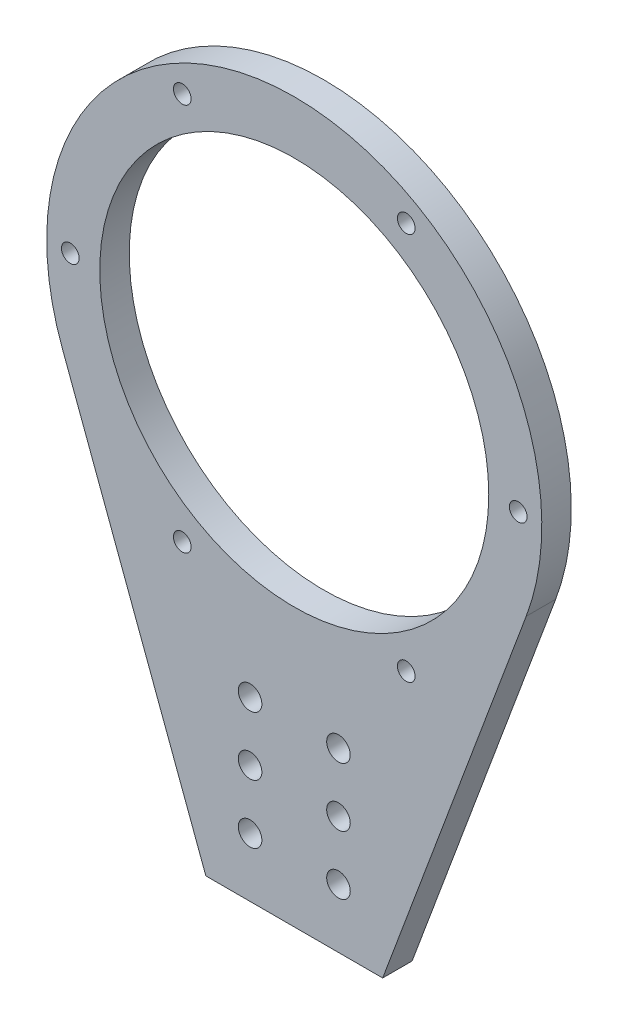
ISO-10303-21;
HEADER;
FILE_DESCRIPTION(('STEP AP214'),'2;1');
FILE_NAME('part.step','',(''),(''),'','','');
FILE_SCHEMA(('AUTOMOTIVE_DESIGN { 1 0 10303 214 1 1 1 1 }'));
ENDSEC;
DATA;
#1=APPLICATION_CONTEXT('core data for automotive mechanical design processes');
#2=APPLICATION_PROTOCOL_DEFINITION('international standard','automotive_design',2000,#1);
#3=PRODUCT_CONTEXT('',#1,'mechanical');
#4=PRODUCT('Part','Part','',(#3));
#5=PRODUCT_RELATED_PRODUCT_CATEGORY('part','',(#4));
#6=PRODUCT_DEFINITION_FORMATION('','',#4);
#7=PRODUCT_DEFINITION_CONTEXT('part definition',#1,'design');
#8=PRODUCT_DEFINITION('design','',#6,#7);
#9=PRODUCT_DEFINITION_SHAPE('','',#8);
#10=(LENGTH_UNIT() NAMED_UNIT(*) SI_UNIT(.MILLI.,.METRE.));
#11=(NAMED_UNIT(*) PLANE_ANGLE_UNIT() SI_UNIT($,.RADIAN.));
#12=(NAMED_UNIT(*) SI_UNIT($,.STERADIAN.) SOLID_ANGLE_UNIT());
#13=UNCERTAINTY_MEASURE_WITH_UNIT(LENGTH_MEASURE(1.E-05),#10,'distance_accuracy_value','');
#14=(GEOMETRIC_REPRESENTATION_CONTEXT(3) GLOBAL_UNCERTAINTY_ASSIGNED_CONTEXT((#13)) GLOBAL_UNIT_ASSIGNED_CONTEXT((#10,
#11,#12)) REPRESENTATION_CONTEXT('',''));
#15=CARTESIAN_POINT('',(0.,0.,0.));
#16=DIRECTION('',(0.,0.,1.));
#17=DIRECTION('',(1.,0.,0.));
#18=AXIS2_PLACEMENT_3D('',#15,#16,#17);
#19=CARTESIAN_POINT('',(0.,0.,5.));
#20=DIRECTION('',(0.,0.,-1.));
#21=DIRECTION('',(-1.,0.,0.));
#22=AXIS2_PLACEMENT_3D('',#19,#20,#21);
#23=CYLINDRICAL_SURFACE('',#22,42.);
#24=CARTESIAN_POINT('',(0.,0.,0.));
#25=DIRECTION('',(0.,0.,1.));
#26=DIRECTION('',(1.,0.,0.));
#27=AXIS2_PLACEMENT_3D('',#24,#25,#26);
#28=CIRCLE('',#27,42.);
#29=CARTESIAN_POINT('',(39.3542837890049,-14.6710717895616,0.));
#30=VERTEX_POINT('',#29);
#31=CARTESIAN_POINT('',(-39.3542837890049,-14.6710717895616,0.));
#32=VERTEX_POINT('',#31);
#33=EDGE_CURVE('E107',#30,#32,#28,.T.);
#34=ORIENTED_EDGE('',*,*,#33,.T.);
#35=DIRECTION('',(0.,0.,-1.));
#36=VECTOR('',#35,1.);
#37=CARTESIAN_POINT('',(-39.3542837890049,-14.6710717895616,5.));
#38=LINE('',#37,#36);
#39=CARTESIAN_POINT('',(-39.3542837890049,-14.6710717895616,5.));
#40=VERTEX_POINT('',#39);
#41=EDGE_CURVE('E11',#40,#32,#38,.T.);
#42=ORIENTED_EDGE('',*,*,#41,.F.);
#43=CARTESIAN_POINT('',(0.,0.,5.));
#44=DIRECTION('',(0.,0.,1.));
#45=DIRECTION('',(1.,0.,0.));
#46=AXIS2_PLACEMENT_3D('',#43,#44,#45);
#47=CIRCLE('',#46,42.);
#48=CARTESIAN_POINT('',(39.3542837890049,-14.6710717895616,5.));
#49=VERTEX_POINT('',#48);
#50=EDGE_CURVE('E80',#49,#40,#47,.T.);
#51=ORIENTED_EDGE('',*,*,#50,.F.);
#52=DIRECTION('',(0.,0.,-1.));
#53=VECTOR('',#52,1.);
#54=CARTESIAN_POINT('',(39.3542837890049,-14.6710717895616,5.));
#55=LINE('',#54,#53);
#56=EDGE_CURVE('E103',#49,#30,#55,.T.);
#57=ORIENTED_EDGE('',*,*,#56,.T.);
#58=EDGE_LOOP('',(#34,#42,#51,#57));
#59=FACE_BOUND('',#58,.T.);
#60=ADVANCED_FACE('F35',(#59),#23,.T.);
#61=CARTESIAN_POINT('',(-39.3542837890049,-14.6710717895616,5.));
#62=DIRECTION('',(-0.937006756881068,-0.3493112330848,0.));
#63=DIRECTION('',(0.3493112330848,-0.937006756881068,0.));
#64=AXIS2_PLACEMENT_3D('',#61,#62,#63);
#65=PLANE('',#64);
#66=DIRECTION('',(-0.3493112330848,0.937006756881068,0.));
#67=VECTOR('',#66,1.);
#68=CARTESIAN_POINT('',(-39.3542837890049,-14.6710717895616,0.));
#69=LINE('',#68,#67);
#70=CARTESIAN_POINT('',(-15.,-80.,0.));
#71=VERTEX_POINT('',#70);
#72=EDGE_CURVE('E90',#71,#32,#69,.T.);
#73=ORIENTED_EDGE('',*,*,#72,.F.);
#74=DIRECTION('',(0.,0.,-1.));
#75=VECTOR('',#74,1.);
#76=CARTESIAN_POINT('',(-15.,-80.,5.));
#77=LINE('',#76,#75);
#78=CARTESIAN_POINT('',(-15.,-80.,5.));
#79=VERTEX_POINT('',#78);
#80=EDGE_CURVE('E45',#79,#71,#77,.T.);
#81=ORIENTED_EDGE('',*,*,#80,.F.);
#82=DIRECTION('',(-0.3493112330848,0.937006756881068,0.));
#83=VECTOR('',#82,1.);
#84=CARTESIAN_POINT('',(-39.3542837890049,-14.6710717895616,5.));
#85=LINE('',#84,#83);
#86=EDGE_CURVE('E88',#79,#40,#85,.T.);
#87=ORIENTED_EDGE('',*,*,#86,.T.);
#88=ORIENTED_EDGE('',*,*,#41,.T.);
#89=EDGE_LOOP('',(#73,#81,#87,#88));
#90=FACE_BOUND('',#89,.T.);
#91=ADVANCED_FACE('F87',(#90),#65,.T.);
#92=CARTESIAN_POINT('',(0.,-80.,5.));
#93=DIRECTION('',(0.,1.,0.));
#94=DIRECTION('',(0.,0.,1.));
#95=AXIS2_PLACEMENT_3D('',#92,#93,#94);
#96=PLANE('',#95);
#97=DIRECTION('',(1.,0.,0.));
#98=VECTOR('',#97,1.);
#99=CARTESIAN_POINT('',(0.,-80.,0.));
#100=LINE('',#99,#98);
#101=CARTESIAN_POINT('',(15.,-80.,0.));
#102=VERTEX_POINT('',#101);
#103=EDGE_CURVE('E69',#71,#102,#100,.T.);
#104=ORIENTED_EDGE('',*,*,#103,.T.);
#105=DIRECTION('',(0.,0.,-1.));
#106=VECTOR('',#105,1.);
#107=CARTESIAN_POINT('',(15.,-80.,5.));
#108=LINE('',#107,#106);
#109=CARTESIAN_POINT('',(15.,-80.,5.));
#110=VERTEX_POINT('',#109);
#111=EDGE_CURVE('E91',#110,#102,#108,.T.);
#112=ORIENTED_EDGE('',*,*,#111,.F.);
#113=DIRECTION('',(1.,0.,0.));
#114=VECTOR('',#113,1.);
#115=CARTESIAN_POINT('',(0.,-80.,5.));
#116=LINE('',#115,#114);
#117=EDGE_CURVE('E93',#79,#110,#116,.T.);
#118=ORIENTED_EDGE('',*,*,#117,.F.);
#119=ORIENTED_EDGE('',*,*,#80,.T.);
#120=EDGE_LOOP('',(#104,#112,#118,#119));
#121=FACE_BOUND('',#120,.T.);
#122=ADVANCED_FACE('F94',(#121),#96,.F.);
#123=CARTESIAN_POINT('',(0.,0.,5.));
#124=DIRECTION('',(0.,0.,-1.));
#125=DIRECTION('',(-1.,0.,0.));
#126=AXIS2_PLACEMENT_3D('',#123,#124,#125);
#127=CYLINDRICAL_SURFACE('',#126,33.);
#128=CARTESIAN_POINT('',(0.,0.,5.));
#129=DIRECTION('',(0.,0.,1.));
#130=DIRECTION('',(1.,0.,0.));
#131=AXIS2_PLACEMENT_3D('',#128,#129,#130);
#132=CIRCLE('',#131,33.);
#133=CARTESIAN_POINT('',(33.,0.,5.));
#134=VERTEX_POINT('',#133);
#135=EDGE_CURVE('E98',#134,#134,#132,.T.);
#136=ORIENTED_EDGE('',*,*,#135,.T.);
#137=EDGE_LOOP('',(#136));
#138=FACE_BOUND('',#137,.T.);
#139=CARTESIAN_POINT('',(0.,0.,0.));
#140=DIRECTION('',(0.,0.,1.));
#141=DIRECTION('',(1.,0.,0.));
#142=AXIS2_PLACEMENT_3D('',#139,#140,#141);
#143=CIRCLE('',#142,33.);
#144=CARTESIAN_POINT('',(33.,0.,0.));
#145=VERTEX_POINT('',#144);
#146=EDGE_CURVE('E104',#145,#145,#143,.T.);
#147=ORIENTED_EDGE('',*,*,#146,.F.);
#148=EDGE_LOOP('',(#147));
#149=FACE_BOUND('',#148,.T.);
#150=ADVANCED_FACE('F37',(#138,#149),#127,.F.);
#151=CARTESIAN_POINT('',(39.3542837890049,-14.6710717895616,5.));
#152=DIRECTION('',(-0.937006756881068,0.3493112330848,0.));
#153=DIRECTION('',(-0.3493112330848,-0.937006756881068,0.));
#154=AXIS2_PLACEMENT_3D('',#151,#152,#153);
#155=PLANE('',#154);
#156=DIRECTION('',(0.3493112330848,0.937006756881068,0.));
#157=VECTOR('',#156,1.);
#158=CARTESIAN_POINT('',(39.3542837890049,-14.6710717895616,0.));
#159=LINE('',#158,#157);
#160=EDGE_CURVE('E75',#102,#30,#159,.T.);
#161=ORIENTED_EDGE('',*,*,#160,.T.);
#162=ORIENTED_EDGE('',*,*,#56,.F.);
#163=DIRECTION('',(0.3493112330848,0.937006756881068,0.));
#164=VECTOR('',#163,1.);
#165=CARTESIAN_POINT('',(39.3542837890049,-14.6710717895616,5.));
#166=LINE('',#165,#164);
#167=EDGE_CURVE('E54',#110,#49,#166,.T.);
#168=ORIENTED_EDGE('',*,*,#167,.F.);
#169=ORIENTED_EDGE('',*,*,#111,.T.);
#170=EDGE_LOOP('',(#161,#162,#168,#169));
#171=FACE_BOUND('',#170,.T.);
#172=ADVANCED_FACE('F173',(#171),#155,.F.);
#173=CARTESIAN_POINT('',(0.,0.,5.));
#174=DIRECTION('',(0.,0.,1.));
#175=DIRECTION('',(1.,0.,0.));
#176=AXIS2_PLACEMENT_3D('',#173,#174,#175);
#177=PLANE('',#176);
#178=CARTESIAN_POINT('',(7.50000000000001,-50.,5.));
#179=DIRECTION('',(0.,0.,1.));
#180=DIRECTION('',(1.,0.,0.));
#181=AXIS2_PLACEMENT_3D('',#178,#179,#180);
#182=CIRCLE('',#181,2.);
#183=CARTESIAN_POINT('',(9.50000000000001,-50.,5.));
#184=VERTEX_POINT('',#183);
#185=EDGE_CURVE('E338',#184,#184,#182,.T.);
#186=ORIENTED_EDGE('',*,*,#185,.F.);
#187=EDGE_LOOP('',(#186));
#188=FACE_BOUND('',#187,.T.);
#189=CARTESIAN_POINT('',(-7.49999999999999,-60.,5.));
#190=DIRECTION('',(0.,0.,1.));
#191=DIRECTION('',(1.,0.,0.));
#192=AXIS2_PLACEMENT_3D('',#189,#190,#191);
#193=CIRCLE('',#192,2.00000000000001);
#194=CARTESIAN_POINT('',(-5.49999999999999,-60.,5.));
#195=VERTEX_POINT('',#194);
#196=EDGE_CURVE('E339',#195,#195,#193,.T.);
#197=ORIENTED_EDGE('',*,*,#196,.F.);
#198=EDGE_LOOP('',(#197));
#199=FACE_BOUND('',#198,.T.);
#200=CARTESIAN_POINT('',(-7.49999999999999,-70.,5.));
#201=DIRECTION('',(0.,0.,1.));
#202=DIRECTION('',(1.,0.,0.));
#203=AXIS2_PLACEMENT_3D('',#200,#201,#202);
#204=CIRCLE('',#203,2.00000000000001);
#205=CARTESIAN_POINT('',(-5.49999999999999,-70.,5.));
#206=VERTEX_POINT('',#205);
#207=EDGE_CURVE('E342',#206,#206,#204,.T.);
#208=ORIENTED_EDGE('',*,*,#207,.F.);
#209=EDGE_LOOP('',(#208));
#210=FACE_BOUND('',#209,.T.);
#211=CARTESIAN_POINT('',(7.50000000000001,-70.,5.));
#212=DIRECTION('',(0.,0.,1.));
#213=DIRECTION('',(1.,0.,0.));
#214=AXIS2_PLACEMENT_3D('',#211,#212,#213);
#215=CIRCLE('',#214,2.);
#216=CARTESIAN_POINT('',(9.50000000000001,-70.,5.));
#217=VERTEX_POINT('',#216);
#218=EDGE_CURVE('E380',#217,#217,#215,.T.);
#219=ORIENTED_EDGE('',*,*,#218,.F.);
#220=EDGE_LOOP('',(#219));
#221=FACE_BOUND('',#220,.T.);
#222=CARTESIAN_POINT('',(7.50000000000001,-60.,5.));
#223=DIRECTION('',(0.,0.,1.));
#224=DIRECTION('',(1.,0.,0.));
#225=AXIS2_PLACEMENT_3D('',#222,#223,#224);
#226=CIRCLE('',#225,2.);
#227=CARTESIAN_POINT('',(9.50000000000001,-60.,5.));
#228=VERTEX_POINT('',#227);
#229=EDGE_CURVE('E348',#228,#228,#226,.T.);
#230=ORIENTED_EDGE('',*,*,#229,.F.);
#231=EDGE_LOOP('',(#230));
#232=FACE_BOUND('',#231,.T.);
#233=CARTESIAN_POINT('',(-7.49999999999999,-50.,5.));
#234=DIRECTION('',(0.,0.,1.));
#235=DIRECTION('',(1.,0.,0.));
#236=AXIS2_PLACEMENT_3D('',#233,#234,#235);
#237=CIRCLE('',#236,2.00000000000001);
#238=CARTESIAN_POINT('',(-5.49999999999999,-50.,5.));
#239=VERTEX_POINT('',#238);
#240=EDGE_CURVE('E138',#239,#239,#237,.T.);
#241=ORIENTED_EDGE('',*,*,#240,.F.);
#242=EDGE_LOOP('',(#241));
#243=FACE_BOUND('',#242,.T.);
#244=CARTESIAN_POINT('',(-19.0000000000002,32.9089653438086,5.));
#245=DIRECTION('',(0.,0.,1.));
#246=DIRECTION('',(1.,0.,0.));
#247=AXIS2_PLACEMENT_3D('',#244,#245,#246);
#248=CIRCLE('',#247,1.5);
#249=CARTESIAN_POINT('',(-17.5000000000002,32.9089653438086,5.));
#250=VERTEX_POINT('',#249);
#251=EDGE_CURVE('E151',#250,#250,#248,.T.);
#252=ORIENTED_EDGE('',*,*,#251,.F.);
#253=EDGE_LOOP('',(#252));
#254=FACE_BOUND('',#253,.T.);
#255=CARTESIAN_POINT('',(-38.,0.,5.));
#256=DIRECTION('',(0.,0.,1.));
#257=DIRECTION('',(1.,0.,0.));
#258=AXIS2_PLACEMENT_3D('',#255,#256,#257);
#259=CIRCLE('',#258,1.5);
#260=CARTESIAN_POINT('',(-36.5,0.,5.));
#261=VERTEX_POINT('',#260);
#262=EDGE_CURVE('E155',#261,#261,#259,.T.);
#263=ORIENTED_EDGE('',*,*,#262,.F.);
#264=EDGE_LOOP('',(#263));
#265=FACE_BOUND('',#264,.T.);
#266=CARTESIAN_POINT('',(-19.0000000000001,-32.9089653438086,5.));
#267=DIRECTION('',(0.,0.,1.));
#268=DIRECTION('',(1.,0.,0.));
#269=AXIS2_PLACEMENT_3D('',#266,#267,#268);
#270=CIRCLE('',#269,1.5);
#271=CARTESIAN_POINT('',(-17.5000000000001,-32.9089653438086,5.));
#272=VERTEX_POINT('',#271);
#273=EDGE_CURVE('E160',#272,#272,#270,.T.);
#274=ORIENTED_EDGE('',*,*,#273,.F.);
#275=EDGE_LOOP('',(#274));
#276=FACE_BOUND('',#275,.T.);
#277=CARTESIAN_POINT('',(19.0000000000002,-32.9089653438086,5.));
#278=DIRECTION('',(0.,0.,1.));
#279=DIRECTION('',(1.,0.,0.));
#280=AXIS2_PLACEMENT_3D('',#277,#278,#279);
#281=CIRCLE('',#280,1.50000000000001);
#282=CARTESIAN_POINT('',(20.5000000000002,-32.9089653438086,5.));
#283=VERTEX_POINT('',#282);
#284=EDGE_CURVE('E351',#283,#283,#281,.T.);
#285=ORIENTED_EDGE('',*,*,#284,.F.);
#286=EDGE_LOOP('',(#285));
#287=FACE_BOUND('',#286,.T.);
#288=CARTESIAN_POINT('',(38.,0.,5.));
#289=DIRECTION('',(0.,0.,1.));
#290=DIRECTION('',(1.,0.,0.));
#291=AXIS2_PLACEMENT_3D('',#288,#289,#290);
#292=CIRCLE('',#291,1.5);
#293=CARTESIAN_POINT('',(39.5,0.,5.));
#294=VERTEX_POINT('',#293);
#295=EDGE_CURVE('E165',#294,#294,#292,.T.);
#296=ORIENTED_EDGE('',*,*,#295,.F.);
#297=EDGE_LOOP('',(#296));
#298=FACE_BOUND('',#297,.T.);
#299=CARTESIAN_POINT('',(19.0000000000001,32.9089653438086,5.));
#300=DIRECTION('',(0.,0.,1.));
#301=DIRECTION('',(1.,0.,0.));
#302=AXIS2_PLACEMENT_3D('',#299,#300,#301);
#303=CIRCLE('',#302,1.5);
#304=CARTESIAN_POINT('',(20.5000000000001,32.9089653438086,5.));
#305=VERTEX_POINT('',#304);
#306=EDGE_CURVE('E120',#305,#305,#303,.T.);
#307=ORIENTED_EDGE('',*,*,#306,.F.);
#308=EDGE_LOOP('',(#307));
#309=FACE_BOUND('',#308,.T.);
#310=ORIENTED_EDGE('',*,*,#135,.F.);
#311=EDGE_LOOP('',(#310));
#312=FACE_BOUND('',#311,.T.);
#313=ORIENTED_EDGE('',*,*,#50,.T.);
#314=ORIENTED_EDGE('',*,*,#86,.F.);
#315=ORIENTED_EDGE('',*,*,#117,.T.);
#316=ORIENTED_EDGE('',*,*,#167,.T.);
#317=EDGE_LOOP('',(#313,#314,#315,#316));
#318=FACE_BOUND('',#317,.T.);
#319=ADVANCED_FACE('F96',(#188,#199,#210,#221,#232,#243,#254,#265,#276,#287,#298,#309,#312,
#318),#177,.T.);
#320=CARTESIAN_POINT('',(0.,0.,0.));
#321=DIRECTION('',(0.,0.,1.));
#322=DIRECTION('',(1.,0.,0.));
#323=AXIS2_PLACEMENT_3D('',#320,#321,#322);
#324=PLANE('',#323);
#325=CARTESIAN_POINT('',(7.50000000000001,-50.,0.));
#326=DIRECTION('',(0.,0.,1.));
#327=DIRECTION('',(1.,0.,0.));
#328=AXIS2_PLACEMENT_3D('',#325,#326,#327);
#329=CIRCLE('',#328,2.);
#330=CARTESIAN_POINT('',(9.50000000000001,-50.,0.));
#331=VERTEX_POINT('',#330);
#332=EDGE_CURVE('E39',#331,#331,#329,.T.);
#333=ORIENTED_EDGE('',*,*,#332,.T.);
#334=EDGE_LOOP('',(#333));
#335=FACE_BOUND('',#334,.T.);
#336=CARTESIAN_POINT('',(-7.49999999999999,-60.,0.));
#337=DIRECTION('',(0.,0.,1.));
#338=DIRECTION('',(1.,0.,0.));
#339=AXIS2_PLACEMENT_3D('',#336,#337,#338);
#340=CIRCLE('',#339,2.00000000000001);
#341=CARTESIAN_POINT('',(-5.49999999999999,-60.,0.));
#342=VERTEX_POINT('',#341);
#343=EDGE_CURVE('E146',#342,#342,#340,.T.);
#344=ORIENTED_EDGE('',*,*,#343,.T.);
#345=EDGE_LOOP('',(#344));
#346=FACE_BOUND('',#345,.T.);
#347=CARTESIAN_POINT('',(-7.49999999999999,-70.,0.));
#348=DIRECTION('',(0.,0.,1.));
#349=DIRECTION('',(1.,0.,0.));
#350=AXIS2_PLACEMENT_3D('',#347,#348,#349);
#351=CIRCLE('',#350,2.00000000000001);
#352=CARTESIAN_POINT('',(-5.49999999999999,-70.,0.));
#353=VERTEX_POINT('',#352);
#354=EDGE_CURVE('E144',#353,#353,#351,.T.);
#355=ORIENTED_EDGE('',*,*,#354,.T.);
#356=EDGE_LOOP('',(#355));
#357=FACE_BOUND('',#356,.T.);
#358=CARTESIAN_POINT('',(7.50000000000001,-70.,0.));
#359=DIRECTION('',(0.,0.,1.));
#360=DIRECTION('',(1.,0.,0.));
#361=AXIS2_PLACEMENT_3D('',#358,#359,#360);
#362=CIRCLE('',#361,2.);
#363=CARTESIAN_POINT('',(9.50000000000001,-70.,0.));
#364=VERTEX_POINT('',#363);
#365=EDGE_CURVE('E141',#364,#364,#362,.T.);
#366=ORIENTED_EDGE('',*,*,#365,.T.);
#367=EDGE_LOOP('',(#366));
#368=FACE_BOUND('',#367,.T.);
#369=CARTESIAN_POINT('',(7.50000000000001,-60.,0.));
#370=DIRECTION('',(0.,0.,1.));
#371=DIRECTION('',(1.,0.,0.));
#372=AXIS2_PLACEMENT_3D('',#369,#370,#371);
#373=CIRCLE('',#372,2.);
#374=CARTESIAN_POINT('',(9.50000000000001,-60.,0.));
#375=VERTEX_POINT('',#374);
#376=EDGE_CURVE('E137',#375,#375,#373,.T.);
#377=ORIENTED_EDGE('',*,*,#376,.T.);
#378=EDGE_LOOP('',(#377));
#379=FACE_BOUND('',#378,.T.);
#380=CARTESIAN_POINT('',(-7.49999999999999,-50.,0.));
#381=DIRECTION('',(0.,0.,1.));
#382=DIRECTION('',(1.,0.,0.));
#383=AXIS2_PLACEMENT_3D('',#380,#381,#382);
#384=CIRCLE('',#383,2.00000000000001);
#385=CARTESIAN_POINT('',(-5.49999999999999,-50.,0.));
#386=VERTEX_POINT('',#385);
#387=EDGE_CURVE('E134',#386,#386,#384,.T.);
#388=ORIENTED_EDGE('',*,*,#387,.T.);
#389=EDGE_LOOP('',(#388));
#390=FACE_BOUND('',#389,.T.);
#391=CARTESIAN_POINT('',(-19.0000000000002,32.9089653438086,0.));
#392=DIRECTION('',(0.,0.,1.));
#393=DIRECTION('',(1.,0.,0.));
#394=AXIS2_PLACEMENT_3D('',#391,#392,#393);
#395=CIRCLE('',#394,1.5);
#396=CARTESIAN_POINT('',(-17.5000000000002,32.9089653438086,0.));
#397=VERTEX_POINT('',#396);
#398=EDGE_CURVE('E108',#397,#397,#395,.T.);
#399=ORIENTED_EDGE('',*,*,#398,.T.);
#400=EDGE_LOOP('',(#399));
#401=FACE_BOUND('',#400,.T.);
#402=CARTESIAN_POINT('',(-38.,0.,0.));
#403=DIRECTION('',(0.,0.,1.));
#404=DIRECTION('',(1.,0.,0.));
#405=AXIS2_PLACEMENT_3D('',#402,#403,#404);
#406=CIRCLE('',#405,1.5);
#407=CARTESIAN_POINT('',(-36.5,0.,0.));
#408=VERTEX_POINT('',#407);
#409=EDGE_CURVE('E129',#408,#408,#406,.T.);
#410=ORIENTED_EDGE('',*,*,#409,.T.);
#411=EDGE_LOOP('',(#410));
#412=FACE_BOUND('',#411,.T.);
#413=CARTESIAN_POINT('',(-19.0000000000001,-32.9089653438086,0.));
#414=DIRECTION('',(0.,0.,1.));
#415=DIRECTION('',(1.,0.,0.));
#416=AXIS2_PLACEMENT_3D('',#413,#414,#415);
#417=CIRCLE('',#416,1.5);
#418=CARTESIAN_POINT('',(-17.5000000000001,-32.9089653438086,0.));
#419=VERTEX_POINT('',#418);
#420=EDGE_CURVE('E126',#419,#419,#417,.T.);
#421=ORIENTED_EDGE('',*,*,#420,.T.);
#422=EDGE_LOOP('',(#421));
#423=FACE_BOUND('',#422,.T.);
#424=CARTESIAN_POINT('',(19.0000000000002,-32.9089653438086,0.));
#425=DIRECTION('',(0.,0.,1.));
#426=DIRECTION('',(1.,0.,0.));
#427=AXIS2_PLACEMENT_3D('',#424,#425,#426);
#428=CIRCLE('',#427,1.50000000000001);
#429=CARTESIAN_POINT('',(20.5000000000002,-32.9089653438086,0.));
#430=VERTEX_POINT('',#429);
#431=EDGE_CURVE('E123',#430,#430,#428,.T.);
#432=ORIENTED_EDGE('',*,*,#431,.T.);
#433=EDGE_LOOP('',(#432));
#434=FACE_BOUND('',#433,.T.);
#435=CARTESIAN_POINT('',(38.,0.,0.));
#436=DIRECTION('',(0.,0.,1.));
#437=DIRECTION('',(1.,0.,0.));
#438=AXIS2_PLACEMENT_3D('',#435,#436,#437);
#439=CIRCLE('',#438,1.5);
#440=CARTESIAN_POINT('',(39.5,0.,0.));
#441=VERTEX_POINT('',#440);
#442=EDGE_CURVE('E119',#441,#441,#439,.T.);
#443=ORIENTED_EDGE('',*,*,#442,.T.);
#444=EDGE_LOOP('',(#443));
#445=FACE_BOUND('',#444,.T.);
#446=CARTESIAN_POINT('',(19.0000000000001,32.9089653438086,0.));
#447=DIRECTION('',(0.,0.,1.));
#448=DIRECTION('',(1.,0.,0.));
#449=AXIS2_PLACEMENT_3D('',#446,#447,#448);
#450=CIRCLE('',#449,1.5);
#451=CARTESIAN_POINT('',(20.5000000000001,32.9089653438086,0.));
#452=VERTEX_POINT('',#451);
#453=EDGE_CURVE('E116',#452,#452,#450,.T.);
#454=ORIENTED_EDGE('',*,*,#453,.T.);
#455=EDGE_LOOP('',(#454));
#456=FACE_BOUND('',#455,.T.);
#457=ORIENTED_EDGE('',*,*,#146,.T.);
#458=EDGE_LOOP('',(#457));
#459=FACE_BOUND('',#458,.T.);
#460=ORIENTED_EDGE('',*,*,#33,.F.);
#461=ORIENTED_EDGE('',*,*,#160,.F.);
#462=ORIENTED_EDGE('',*,*,#103,.F.);
#463=ORIENTED_EDGE('',*,*,#72,.T.);
#464=EDGE_LOOP('',(#460,#461,#462,#463));
#465=FACE_BOUND('',#464,.T.);
#466=ADVANCED_FACE('F172',(#335,#346,#357,#368,#379,#390,#401,#412,#423,#434,#445,#456,#459,
#465),#324,.F.);
#467=CARTESIAN_POINT('',(19.0000000000001,32.9089653438086,-2.));
#468=DIRECTION('',(0.,0.,1.));
#469=DIRECTION('',(1.,0.,0.));
#470=AXIS2_PLACEMENT_3D('',#467,#468,#469);
#471=CYLINDRICAL_SURFACE('',#470,1.5);
#472=ORIENTED_EDGE('',*,*,#306,.T.);
#473=EDGE_LOOP('',(#472));
#474=FACE_BOUND('',#473,.T.);
#475=ORIENTED_EDGE('',*,*,#453,.F.);
#476=EDGE_LOOP('',(#475));
#477=FACE_BOUND('',#476,.T.);
#478=ADVANCED_FACE('F180',(#474,#477),#471,.F.);
#479=CARTESIAN_POINT('',(38.,0.,-2.));
#480=DIRECTION('',(0.,0.,1.));
#481=DIRECTION('',(1.,0.,0.));
#482=AXIS2_PLACEMENT_3D('',#479,#480,#481);
#483=CYLINDRICAL_SURFACE('',#482,1.5);
#484=ORIENTED_EDGE('',*,*,#295,.T.);
#485=EDGE_LOOP('',(#484));
#486=FACE_BOUND('',#485,.T.);
#487=ORIENTED_EDGE('',*,*,#442,.F.);
#488=EDGE_LOOP('',(#487));
#489=FACE_BOUND('',#488,.T.);
#490=ADVANCED_FACE('F213',(#486,#489),#483,.F.);
#491=CARTESIAN_POINT('',(19.0000000000002,-32.9089653438086,-2.));
#492=DIRECTION('',(0.,0.,1.));
#493=DIRECTION('',(1.,0.,0.));
#494=AXIS2_PLACEMENT_3D('',#491,#492,#493);
#495=CYLINDRICAL_SURFACE('',#494,1.50000000000001);
#496=ORIENTED_EDGE('',*,*,#284,.T.);
#497=EDGE_LOOP('',(#496));
#498=FACE_BOUND('',#497,.T.);
#499=ORIENTED_EDGE('',*,*,#431,.F.);
#500=EDGE_LOOP('',(#499));
#501=FACE_BOUND('',#500,.T.);
#502=ADVANCED_FACE('F223',(#498,#501),#495,.F.);
#503=CARTESIAN_POINT('',(-19.0000000000001,-32.9089653438086,-2.));
#504=DIRECTION('',(0.,0.,1.));
#505=DIRECTION('',(1.,0.,0.));
#506=AXIS2_PLACEMENT_3D('',#503,#504,#505);
#507=CYLINDRICAL_SURFACE('',#506,1.5);
#508=ORIENTED_EDGE('',*,*,#273,.T.);
#509=EDGE_LOOP('',(#508));
#510=FACE_BOUND('',#509,.T.);
#511=ORIENTED_EDGE('',*,*,#420,.F.);
#512=EDGE_LOOP('',(#511));
#513=FACE_BOUND('',#512,.T.);
#514=ADVANCED_FACE('F233',(#510,#513),#507,.F.);
#515=CARTESIAN_POINT('',(-38.,0.,-2.));
#516=DIRECTION('',(0.,0.,1.));
#517=DIRECTION('',(1.,0.,0.));
#518=AXIS2_PLACEMENT_3D('',#515,#516,#517);
#519=CYLINDRICAL_SURFACE('',#518,1.5);
#520=ORIENTED_EDGE('',*,*,#262,.T.);
#521=EDGE_LOOP('',(#520));
#522=FACE_BOUND('',#521,.T.);
#523=ORIENTED_EDGE('',*,*,#409,.F.);
#524=EDGE_LOOP('',(#523));
#525=FACE_BOUND('',#524,.T.);
#526=ADVANCED_FACE('F243',(#522,#525),#519,.F.);
#527=CARTESIAN_POINT('',(-19.0000000000002,32.9089653438086,-2.));
#528=DIRECTION('',(0.,0.,1.));
#529=DIRECTION('',(1.,0.,0.));
#530=AXIS2_PLACEMENT_3D('',#527,#528,#529);
#531=CYLINDRICAL_SURFACE('',#530,1.5);
#532=ORIENTED_EDGE('',*,*,#251,.T.);
#533=EDGE_LOOP('',(#532));
#534=FACE_BOUND('',#533,.T.);
#535=ORIENTED_EDGE('',*,*,#398,.F.);
#536=EDGE_LOOP('',(#535));
#537=FACE_BOUND('',#536,.T.);
#538=ADVANCED_FACE('F253',(#534,#537),#531,.F.);
#539=CARTESIAN_POINT('',(-7.49999999999999,-50.,-2.));
#540=DIRECTION('',(0.,0.,1.));
#541=DIRECTION('',(1.,0.,0.));
#542=AXIS2_PLACEMENT_3D('',#539,#540,#541);
#543=CYLINDRICAL_SURFACE('',#542,2.00000000000001);
#544=ORIENTED_EDGE('',*,*,#240,.T.);
#545=EDGE_LOOP('',(#544));
#546=FACE_BOUND('',#545,.T.);
#547=ORIENTED_EDGE('',*,*,#387,.F.);
#548=EDGE_LOOP('',(#547));
#549=FACE_BOUND('',#548,.T.);
#550=ADVANCED_FACE('F262',(#546,#549),#543,.F.);
#551=CARTESIAN_POINT('',(7.50000000000001,-60.,-2.));
#552=DIRECTION('',(0.,0.,1.));
#553=DIRECTION('',(1.,0.,0.));
#554=AXIS2_PLACEMENT_3D('',#551,#552,#553);
#555=CYLINDRICAL_SURFACE('',#554,2.);
#556=ORIENTED_EDGE('',*,*,#229,.T.);
#557=EDGE_LOOP('',(#556));
#558=FACE_BOUND('',#557,.T.);
#559=ORIENTED_EDGE('',*,*,#376,.F.);
#560=EDGE_LOOP('',(#559));
#561=FACE_BOUND('',#560,.T.);
#562=ADVANCED_FACE('F282',(#558,#561),#555,.F.);
#563=CARTESIAN_POINT('',(7.50000000000001,-70.,-2.));
#564=DIRECTION('',(0.,0.,1.));
#565=DIRECTION('',(1.,0.,0.));
#566=AXIS2_PLACEMENT_3D('',#563,#564,#565);
#567=CYLINDRICAL_SURFACE('',#566,2.);
#568=ORIENTED_EDGE('',*,*,#218,.T.);
#569=EDGE_LOOP('',(#568));
#570=FACE_BOUND('',#569,.T.);
#571=ORIENTED_EDGE('',*,*,#365,.F.);
#572=EDGE_LOOP('',(#571));
#573=FACE_BOUND('',#572,.T.);
#574=ADVANCED_FACE('F292',(#570,#573),#567,.F.);
#575=CARTESIAN_POINT('',(-7.49999999999999,-70.,-2.));
#576=DIRECTION('',(0.,0.,1.));
#577=DIRECTION('',(1.,0.,0.));
#578=AXIS2_PLACEMENT_3D('',#575,#576,#577);
#579=CYLINDRICAL_SURFACE('',#578,2.00000000000001);
#580=ORIENTED_EDGE('',*,*,#207,.T.);
#581=EDGE_LOOP('',(#580));
#582=FACE_BOUND('',#581,.T.);
#583=ORIENTED_EDGE('',*,*,#354,.F.);
#584=EDGE_LOOP('',(#583));
#585=FACE_BOUND('',#584,.T.);
#586=ADVANCED_FACE('F302',(#582,#585),#579,.F.);
#587=CARTESIAN_POINT('',(-7.49999999999999,-60.,-2.));
#588=DIRECTION('',(0.,0.,1.));
#589=DIRECTION('',(1.,0.,0.));
#590=AXIS2_PLACEMENT_3D('',#587,#588,#589);
#591=CYLINDRICAL_SURFACE('',#590,2.00000000000001);
#592=ORIENTED_EDGE('',*,*,#196,.T.);
#593=EDGE_LOOP('',(#592));
#594=FACE_BOUND('',#593,.T.);
#595=ORIENTED_EDGE('',*,*,#343,.F.);
#596=EDGE_LOOP('',(#595));
#597=FACE_BOUND('',#596,.T.);
#598=ADVANCED_FACE('F312',(#594,#597),#591,.F.);
#599=CARTESIAN_POINT('',(7.50000000000001,-50.,-2.));
#600=DIRECTION('',(0.,0.,1.));
#601=DIRECTION('',(1.,0.,0.));
#602=AXIS2_PLACEMENT_3D('',#599,#600,#601);
#603=CYLINDRICAL_SURFACE('',#602,2.);
#604=ORIENTED_EDGE('',*,*,#185,.T.);
#605=EDGE_LOOP('',(#604));
#606=FACE_BOUND('',#605,.T.);
#607=ORIENTED_EDGE('',*,*,#332,.F.);
#608=EDGE_LOOP('',(#607));
#609=FACE_BOUND('',#608,.T.);
#610=ADVANCED_FACE('F322',(#606,#609),#603,.F.);
#611=CLOSED_SHELL('',(#60,#91,#122,#150,#172,#319,#466,#478,#490,#502,#514,#526,#538,#550,#562,
#574,#586,#598,#610));
#612=MANIFOLD_SOLID_BREP('B2',#611);
#613=ADVANCED_BREP_SHAPE_REPRESENTATION('',(#18,#612),#14);
#614=SHAPE_DEFINITION_REPRESENTATION(#9,#613);
ENDSEC;
END-ISO-10303-21;
